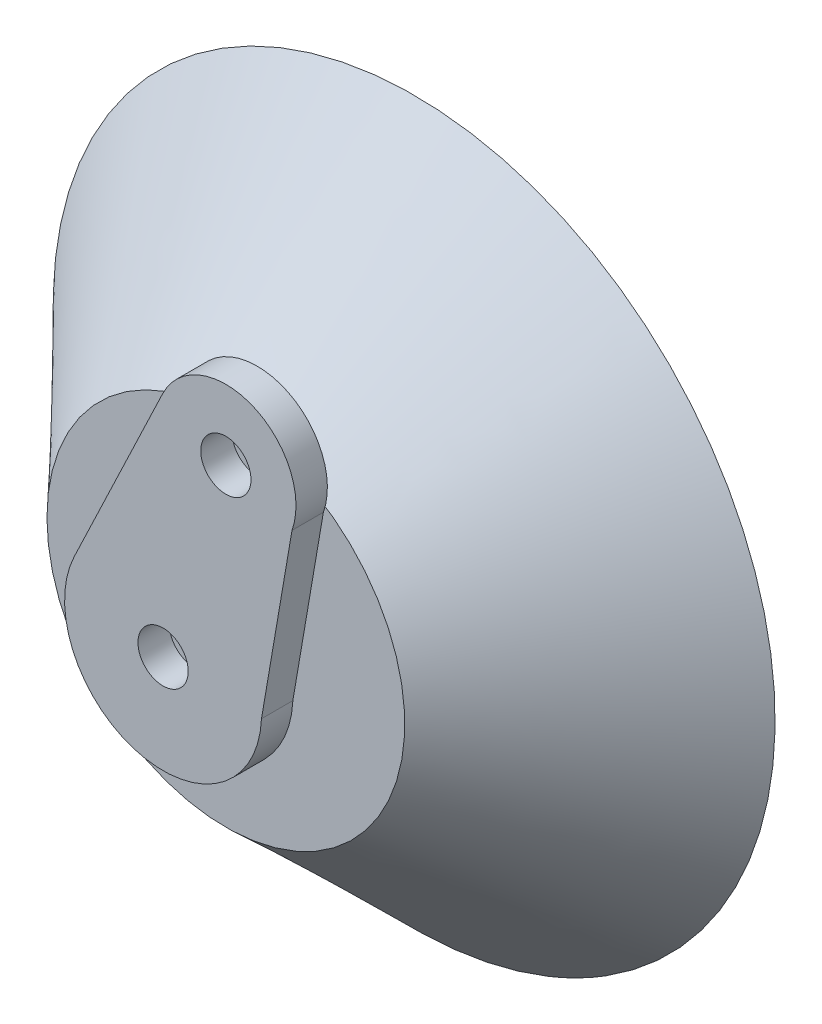
ISO-10303-21;
HEADER;
FILE_DESCRIPTION(('STEP AP214'),'2;1');
FILE_NAME('part.step','',(''),(''),'','','');
FILE_SCHEMA(('AUTOMOTIVE_DESIGN { 1 0 10303 214 1 1 1 1 }'));
ENDSEC;
DATA;
#1=APPLICATION_CONTEXT('core data for automotive mechanical design processes');
#2=APPLICATION_PROTOCOL_DEFINITION('international standard','automotive_design',2000,#1);
#3=PRODUCT_CONTEXT('',#1,'mechanical');
#4=PRODUCT('Part','Part','',(#3));
#5=PRODUCT_RELATED_PRODUCT_CATEGORY('part','',(#4));
#6=PRODUCT_DEFINITION_FORMATION('','',#4);
#7=PRODUCT_DEFINITION_CONTEXT('part definition',#1,'design');
#8=PRODUCT_DEFINITION('design','',#6,#7);
#9=PRODUCT_DEFINITION_SHAPE('','',#8);
#10=(LENGTH_UNIT() NAMED_UNIT(*) SI_UNIT(.MILLI.,.METRE.));
#11=(NAMED_UNIT(*) PLANE_ANGLE_UNIT() SI_UNIT($,.RADIAN.));
#12=(NAMED_UNIT(*) SI_UNIT($,.STERADIAN.) SOLID_ANGLE_UNIT());
#13=UNCERTAINTY_MEASURE_WITH_UNIT(LENGTH_MEASURE(1.E-05),#10,'distance_accuracy_value','');
#14=(GEOMETRIC_REPRESENTATION_CONTEXT(3) GLOBAL_UNCERTAINTY_ASSIGNED_CONTEXT((#13)) GLOBAL_UNIT_ASSIGNED_CONTEXT((#10,
#11,#12)) REPRESENTATION_CONTEXT('',''));
#15=CARTESIAN_POINT('',(0.,0.,0.));
#16=DIRECTION('',(0.,0.,1.));
#17=DIRECTION('',(1.,0.,0.));
#18=AXIS2_PLACEMENT_3D('',#15,#16,#17);
#19=CARTESIAN_POINT('',(0.,0.,40.));
#20=DIRECTION('',(0.,0.,1.));
#21=DIRECTION('',(1.,0.,0.));
#22=AXIS2_PLACEMENT_3D('',#19,#20,#21);
#23=PLANE('',#22);
#24=CARTESIAN_POINT('',(10.,31.4483703870328,40.));
#25=DIRECTION('',(0.,0.,1.));
#26=DIRECTION('',(1.,0.,0.));
#27=AXIS2_PLACEMENT_3D('',#24,#25,#26);
#28=CIRCLE('',#27,4.);
#29=CARTESIAN_POINT('',(14.,31.4483703870328,40.));
#30=VERTEX_POINT('',#29);
#31=EDGE_CURVE('E112',#30,#30,#28,.T.);
#32=ORIENTED_EDGE('',*,*,#31,.F.);
#33=EDGE_LOOP('',(#32));
#34=FACE_BOUND('',#33,.T.);
#35=CARTESIAN_POINT('',(0.,0.,40.));
#36=DIRECTION('',(0.,0.,1.));
#37=DIRECTION('',(1.,0.,0.));
#38=AXIS2_PLACEMENT_3D('',#35,#36,#37);
#39=CIRCLE('',#38,15.6890980476129);
#40=CARTESIAN_POINT('',(-14.1599177681682,6.75607329343942,40.));
#41=VERTEX_POINT('',#40);
#42=CARTESIAN_POINT('',(15.674084091578,-0.686210928034234,40.));
#43=VERTEX_POINT('',#42);
#44=EDGE_CURVE('E97',#41,#43,#39,.T.);
#45=ORIENTED_EDGE('',*,*,#44,.T.);
#46=DIRECTION('',(0.168641585651094,0.985677439931078,0.));
#47=VECTOR('',#46,1.);
#48=CARTESIAN_POINT('',(20.5365896802842,27.734193456935,40.));
#49=LINE('',#48,#47);
#50=CARTESIAN_POINT('',(20.5365896802842,27.734193456935,40.));
#51=VERTEX_POINT('',#50);
#52=EDGE_CURVE('E92',#43,#51,#49,.T.);
#53=ORIENTED_EDGE('',*,*,#52,.T.);
#54=CARTESIAN_POINT('',(10.,31.4483703870328,40.));
#55=DIRECTION('',(0.,0.,1.));
#56=DIRECTION('',(1.,0.,0.));
#57=AXIS2_PLACEMENT_3D('',#54,#55,#56);
#58=CIRCLE('',#57,11.1720558698362);
#59=CARTESIAN_POINT('',(-0.0831412958332035,36.2593052199946,40.));
#60=VERTEX_POINT('',#59);
#61=EDGE_CURVE('E95',#51,#60,#58,.T.);
#62=ORIENTED_EDGE('',*,*,#61,.T.);
#63=DIRECTION('',(-0.430622160237399,-0.902532301423321,0.));
#64=VECTOR('',#63,1.);
#65=CARTESIAN_POINT('',(-0.0831412958332053,36.2593052199946,40.));
#66=LINE('',#65,#64);
#67=EDGE_CURVE('E62',#60,#41,#66,.T.);
#68=ORIENTED_EDGE('',*,*,#67,.T.);
#69=EDGE_LOOP('',(#45,#53,#62,#68));
#70=FACE_BOUND('',#69,.T.);
#71=CARTESIAN_POINT('',(0.,0.,40.));
#72=DIRECTION('',(0.,0.,1.));
#73=DIRECTION('',(1.,0.,0.));
#74=AXIS2_PLACEMENT_3D('',#71,#72,#73);
#75=CIRCLE('',#74,4.);
#76=CARTESIAN_POINT('',(4.,0.,40.));
#77=VERTEX_POINT('',#76);
#78=EDGE_CURVE('E127',#77,#77,#75,.T.);
#79=ORIENTED_EDGE('',*,*,#78,.F.);
#80=EDGE_LOOP('',(#79));
#81=FACE_BOUND('',#80,.T.);
#82=ADVANCED_FACE('F45',(#34,#70,#81),#23,.T.);
#83=CARTESIAN_POINT('',(0.,0.,35.));
#84=DIRECTION('',(0.,0.,1.));
#85=DIRECTION('',(1.,0.,0.));
#86=AXIS2_PLACEMENT_3D('',#83,#84,#85);
#87=PLANE('',#86);
#88=CARTESIAN_POINT('',(10.,31.4483703870328,35.));
#89=DIRECTION('',(0.,0.,1.));
#90=DIRECTION('',(1.,0.,0.));
#91=AXIS2_PLACEMENT_3D('',#88,#89,#90);
#92=CIRCLE('',#91,4.);
#93=CARTESIAN_POINT('',(14.,31.4483703870328,35.));
#94=VERTEX_POINT('',#93);
#95=EDGE_CURVE('E124',#94,#94,#92,.T.);
#96=ORIENTED_EDGE('',*,*,#95,.T.);
#97=EDGE_LOOP('',(#96));
#98=FACE_BOUND('',#97,.T.);
#99=CARTESIAN_POINT('',(0.,0.,35.));
#100=DIRECTION('',(0.,0.,1.));
#101=DIRECTION('',(1.,0.,0.));
#102=AXIS2_PLACEMENT_3D('',#99,#100,#101);
#103=CIRCLE('',#102,15.6890980476129);
#104=CARTESIAN_POINT('',(-14.1599177681682,6.75607329343942,35.));
#105=VERTEX_POINT('',#104);
#106=CARTESIAN_POINT('',(15.674084091578,-0.686210928034234,35.));
#107=VERTEX_POINT('',#106);
#108=EDGE_CURVE('E109',#105,#107,#103,.T.);
#109=ORIENTED_EDGE('',*,*,#108,.F.);
#110=DIRECTION('',(-0.430622160237399,-0.902532301423321,0.));
#111=VECTOR('',#110,1.);
#112=CARTESIAN_POINT('',(-0.0831412958332053,36.2593052199946,35.));
#113=LINE('',#112,#111);
#114=CARTESIAN_POINT('',(-0.0831412958332035,36.2593052199946,35.));
#115=VERTEX_POINT('',#114);
#116=EDGE_CURVE('E85',#115,#105,#113,.T.);
#117=ORIENTED_EDGE('',*,*,#116,.F.);
#118=CARTESIAN_POINT('',(10.,31.4483703870328,35.));
#119=DIRECTION('',(0.,0.,1.));
#120=DIRECTION('',(1.,0.,0.));
#121=AXIS2_PLACEMENT_3D('',#118,#119,#120);
#122=CIRCLE('',#121,11.1720558698362);
#123=CARTESIAN_POINT('',(20.5365896802842,27.734193456935,35.));
#124=VERTEX_POINT('',#123);
#125=EDGE_CURVE('E79',#124,#115,#122,.T.);
#126=ORIENTED_EDGE('',*,*,#125,.F.);
#127=DIRECTION('',(0.168641585651094,0.985677439931078,0.));
#128=VECTOR('',#127,1.);
#129=CARTESIAN_POINT('',(20.5365896802842,27.734193456935,35.));
#130=LINE('',#129,#128);
#131=EDGE_CURVE('E101',#107,#124,#130,.T.);
#132=ORIENTED_EDGE('',*,*,#131,.F.);
#133=EDGE_LOOP('',(#109,#117,#126,#132));
#134=FACE_BOUND('',#133,.T.);
#135=CARTESIAN_POINT('',(0.,0.,35.));
#136=DIRECTION('',(0.,0.,1.));
#137=DIRECTION('',(1.,0.,0.));
#138=AXIS2_PLACEMENT_3D('',#135,#136,#137);
#139=CIRCLE('',#138,4.);
#140=CARTESIAN_POINT('',(4.,0.,35.));
#141=VERTEX_POINT('',#140);
#142=EDGE_CURVE('E130',#141,#141,#139,.T.);
#143=ORIENTED_EDGE('',*,*,#142,.T.);
#144=EDGE_LOOP('',(#143));
#145=FACE_BOUND('',#144,.T.);
#146=ADVANCED_FACE('F120',(#98,#134,#145),#87,.F.);
#147=CARTESIAN_POINT('',(0.,0.,40.));
#148=DIRECTION('',(0.,0.,-1.));
#149=DIRECTION('',(-1.,0.,0.));
#150=AXIS2_PLACEMENT_3D('',#147,#148,#149);
#151=CYLINDRICAL_SURFACE('',#150,15.6890980476129);
#152=ORIENTED_EDGE('',*,*,#108,.T.);
#153=DIRECTION('',(0.,0.,-1.));
#154=VECTOR('',#153,1.);
#155=CARTESIAN_POINT('',(15.674084091578,-0.686210928034234,40.));
#156=LINE('',#155,#154);
#157=EDGE_CURVE('E13',#43,#107,#156,.T.);
#158=ORIENTED_EDGE('',*,*,#157,.F.);
#159=ORIENTED_EDGE('',*,*,#44,.F.);
#160=DIRECTION('',(0.,0.,-1.));
#161=VECTOR('',#160,1.);
#162=CARTESIAN_POINT('',(-14.1599177681682,6.75607329343942,40.));
#163=LINE('',#162,#161);
#164=EDGE_CURVE('E105',#41,#105,#163,.T.);
#165=ORIENTED_EDGE('',*,*,#164,.T.);
#166=EDGE_LOOP('',(#152,#158,#159,#165));
#167=FACE_BOUND('',#166,.T.);
#168=ADVANCED_FACE('F47',(#167),#151,.T.);
#169=CARTESIAN_POINT('',(20.5365896802842,27.734193456935,40.));
#170=DIRECTION('',(-0.985677439931078,0.168641585651094,0.));
#171=DIRECTION('',(-0.168641585651094,-0.985677439931078,0.));
#172=AXIS2_PLACEMENT_3D('',#169,#170,#171);
#173=PLANE('',#172);
#174=ORIENTED_EDGE('',*,*,#131,.T.);
#175=DIRECTION('',(0.,0.,-1.));
#176=VECTOR('',#175,1.);
#177=CARTESIAN_POINT('',(20.5365896802842,27.734193456935,40.));
#178=LINE('',#177,#176);
#179=EDGE_CURVE('E54',#51,#124,#178,.T.);
#180=ORIENTED_EDGE('',*,*,#179,.F.);
#181=ORIENTED_EDGE('',*,*,#52,.F.);
#182=ORIENTED_EDGE('',*,*,#157,.T.);
#183=EDGE_LOOP('',(#174,#180,#181,#182));
#184=FACE_BOUND('',#183,.T.);
#185=ADVANCED_FACE('F100',(#184),#173,.F.);
#186=CARTESIAN_POINT('',(10.,31.4483703870328,40.));
#187=DIRECTION('',(0.,0.,-1.));
#188=DIRECTION('',(-1.,0.,0.));
#189=AXIS2_PLACEMENT_3D('',#186,#187,#188);
#190=CYLINDRICAL_SURFACE('',#189,11.1720558698362);
#191=ORIENTED_EDGE('',*,*,#125,.T.);
#192=DIRECTION('',(0.,0.,-1.));
#193=VECTOR('',#192,1.);
#194=CARTESIAN_POINT('',(-0.0831412958332035,36.2593052199946,40.));
#195=LINE('',#194,#193);
#196=EDGE_CURVE('E102',#60,#115,#195,.T.);
#197=ORIENTED_EDGE('',*,*,#196,.F.);
#198=ORIENTED_EDGE('',*,*,#61,.F.);
#199=ORIENTED_EDGE('',*,*,#179,.T.);
#200=EDGE_LOOP('',(#191,#197,#198,#199));
#201=FACE_BOUND('',#200,.T.);
#202=ADVANCED_FACE('F103',(#201),#190,.T.);
#203=CARTESIAN_POINT('',(-0.0831412958332053,36.2593052199946,40.));
#204=DIRECTION('',(0.902532301423321,-0.430622160237399,0.));
#205=DIRECTION('',(0.430622160237399,0.902532301423321,0.));
#206=AXIS2_PLACEMENT_3D('',#203,#204,#205);
#207=PLANE('',#206);
#208=ORIENTED_EDGE('',*,*,#116,.T.);
#209=ORIENTED_EDGE('',*,*,#164,.F.);
#210=ORIENTED_EDGE('',*,*,#67,.F.);
#211=ORIENTED_EDGE('',*,*,#196,.T.);
#212=EDGE_LOOP('',(#208,#209,#210,#211));
#213=FACE_BOUND('',#212,.T.);
#214=ADVANCED_FACE('F117',(#213),#207,.F.);
#215=CARTESIAN_POINT('',(10.,31.4483703870328,40.));
#216=DIRECTION('',(0.,0.,-1.));
#217=DIRECTION('',(-1.,0.,0.));
#218=AXIS2_PLACEMENT_3D('',#215,#216,#217);
#219=CYLINDRICAL_SURFACE('',#218,4.);
#220=ORIENTED_EDGE('',*,*,#31,.T.);
#221=EDGE_LOOP('',(#220));
#222=FACE_BOUND('',#221,.T.);
#223=ORIENTED_EDGE('',*,*,#95,.F.);
#224=EDGE_LOOP('',(#223));
#225=FACE_BOUND('',#224,.T.);
#226=ADVANCED_FACE('F148',(#222,#225),#219,.F.);
#227=CARTESIAN_POINT('',(0.,0.,40.));
#228=DIRECTION('',(0.,0.,-1.));
#229=DIRECTION('',(-1.,0.,0.));
#230=AXIS2_PLACEMENT_3D('',#227,#228,#229);
#231=CYLINDRICAL_SURFACE('',#230,4.);
#232=ORIENTED_EDGE('',*,*,#78,.T.);
#233=EDGE_LOOP('',(#232));
#234=FACE_BOUND('',#233,.T.);
#235=ORIENTED_EDGE('',*,*,#142,.F.);
#236=EDGE_LOOP('',(#235));
#237=FACE_BOUND('',#236,.T.);
#238=ADVANCED_FACE('F136',(#234,#237),#231,.F.);
#239=CLOSED_SHELL('',(#82,#146,#168,#185,#202,#214,#226,#238));
#240=MANIFOLD_SOLID_BREP('B2',#239);
#241=CARTESIAN_POINT('',(0.,0.,30.));
#242=DIRECTION('',(0.,0.,1.));
#243=DIRECTION('',(1.,0.,0.));
#244=AXIS2_PLACEMENT_3D('',#241,#242,#243);
#245=PLANE('',#244);
#246=CARTESIAN_POINT('',(0.,0.,30.));
#247=DIRECTION('',(0.,0.,1.));
#248=DIRECTION('',(1.,0.,0.));
#249=AXIS2_PLACEMENT_3D('',#246,#247,#248);
#250=CIRCLE('',#249,10.);
#251=CARTESIAN_POINT('',(10.,0.,30.));
#252=VERTEX_POINT('',#251);
#253=EDGE_CURVE('E285',#252,#252,#250,.T.);
#254=ORIENTED_EDGE('',*,*,#253,.F.);
#255=EDGE_LOOP('',(#254));
#256=FACE_BOUND('',#255,.T.);
#257=CARTESIAN_POINT('',(0.,0.,30.));
#258=DIRECTION('',(0.,0.,1.));
#259=DIRECTION('',(1.,0.,0.));
#260=AXIS2_PLACEMENT_3D('',#257,#258,#259);
#261=CIRCLE('',#260,28.5);
#262=CARTESIAN_POINT('',(0.80571115295279,28.4886087680323,30.));
#263=VERTEX_POINT('',#262);
#264=EDGE_CURVE('E218',#263,#263,#261,.T.);
#265=ORIENTED_EDGE('',*,*,#264,.T.);
#266=EDGE_LOOP('',(#265));
#267=FACE_BOUND('',#266,.T.);
#268=ADVANCED_FACE('F210',(#256,#267),#245,.T.);
#269=CARTESIAN_POINT('',(0.,0.,0.));
#270=DIRECTION('',(0.,0.,1.));
#271=DIRECTION('',(1.,0.,0.));
#272=AXIS2_PLACEMENT_3D('',#269,#270,#271);
#273=PLANE('',#272);
#274=CARTESIAN_POINT('',(0.,0.,0.));
#275=DIRECTION('',(0.,0.,1.));
#276=DIRECTION('',(1.,0.,0.));
#277=AXIS2_PLACEMENT_3D('',#274,#275,#276);
#278=CIRCLE('',#277,10.);
#279=CARTESIAN_POINT('',(10.,0.,0.));
#280=VERTEX_POINT('',#279);
#281=EDGE_CURVE('E214',#280,#280,#278,.T.);
#282=ORIENTED_EDGE('',*,*,#281,.T.);
#283=EDGE_LOOP('',(#282));
#284=FACE_BOUND('',#283,.T.);
#285=CARTESIAN_POINT('',(0.,0.,0.));
#286=DIRECTION('',(0.,0.,1.));
#287=DIRECTION('',(1.,0.,0.));
#288=AXIS2_PLACEMENT_3D('',#285,#286,#287);
#289=CIRCLE('',#288,57.5);
#290=CARTESIAN_POINT('',(-11.5187221230247,56.3344392059825,0.));
#291=VERTEX_POINT('',#290);
#292=EDGE_CURVE('E44',#291,#291,#289,.T.);
#293=ORIENTED_EDGE('',*,*,#292,.F.);
#294=EDGE_LOOP('',(#293));
#295=FACE_BOUND('',#294,.T.);
#296=ADVANCED_FACE('F263',(#284,#295),#273,.F.);
#297=CARTESIAN_POINT('',(-11.5187221230247,56.3344392059825,0.));
#298=CARTESIAN_POINT('',(0.80571115295279,28.4886087680323,30.));
#299=CARTESIAN_POINT('',(-124.18760053499,33.2969949599331,0.));
#300=CARTESIAN_POINT('',(-56.1715063831118,30.1000310739379,30.));
#301=CARTESIAN_POINT('',(-101.15015628894,-79.371883452032,0.));
#302=CARTESIAN_POINT('',(-57.7829286890174,-26.8771864621267,30.));
#303=CARTESIAN_POINT('',(11.5187221230247,-56.3344392059825,0.));
#304=CARTESIAN_POINT('',(-0.805711152952793,-28.4886087680323,30.));
#305=CARTESIAN_POINT('',(124.18760053499,-33.296994959933,0.));
#306=CARTESIAN_POINT('',(56.1715063831118,-30.1000310739379,30.));
#307=CARTESIAN_POINT('',(101.15015628894,79.371883452032,0.));
#308=CARTESIAN_POINT('',(57.7829286890174,26.8771864621267,30.));
#309=CARTESIAN_POINT('',(-11.5187221230247,56.3344392059825,0.));
#310=CARTESIAN_POINT('',(0.80571115295279,28.4886087680323,30.));
#311=(BOUNDED_SURFACE() B_SPLINE_SURFACE(3,1,((#297,#298),(#299,#300),(#301,#302),(#303,#304),
(#305,#306),(#307,#308),(#309,#310)),.UNSPECIFIED.,.T.,.F.,.F.) B_SPLINE_SURFACE_WITH_KNOTS((4,
3,4),(2,2),(0.,0.5,1.),(0.,1.),
.UNSPECIFIED.) GEOMETRIC_REPRESENTATION_ITEM() RATIONAL_B_SPLINE_SURFACE(((1.,1.),
(0.333333333333333,0.333333333333333),(0.333333333333333,0.333333333333333),(1.,1.),
(0.333333333333333,0.333333333333333),(0.333333333333333,0.333333333333333),(1.,1.))) REPRESENTATION_ITEM('') SURFACE());
#312=CARTESIAN_POINT('',(-11.5187221230247,56.3344392059825,0.));
#313=CARTESIAN_POINT('',(-11.3903426097333,56.0443784722539,0.312500000000001));
#314=CARTESIAN_POINT('',(-11.2619630964418,55.7543177385252,0.625000000000001));
#315=CARTESIAN_POINT('',(-11.005204069859,55.1741962710679,1.25));
#316=CARTESIAN_POINT('',(-10.8768245565676,54.8841355373393,1.5625));
#317=CARTESIAN_POINT('',(-10.6200655299847,54.304014069882,2.1875));
#318=CARTESIAN_POINT('',(-10.4916860166933,54.0139533361533,2.5));
#319=CARTESIAN_POINT('',(-10.2349269901104,53.4338318686961,3.125));
#320=CARTESIAN_POINT('',(-10.106547476819,53.1437711349674,3.4375));
#321=CARTESIAN_POINT('',(-9.8497884502361,52.5636496675101,4.0625));
#322=CARTESIAN_POINT('',(-9.72140893694466,52.2735889337815,4.375));
#323=CARTESIAN_POINT('',(-9.46464991036179,51.6934674663242,5.));
#324=CARTESIAN_POINT('',(-9.33627039707036,51.4034067325955,5.3125));
#325=CARTESIAN_POINT('',(-9.0795113704875,50.8232852651382,5.9375));
#326=CARTESIAN_POINT('',(-8.95113185719607,50.5332245314096,6.25));
#327=CARTESIAN_POINT('',(-8.6943728306132,49.9531030639523,6.875));
#328=CARTESIAN_POINT('',(-8.56599331732177,49.6630423302236,7.1875));
#329=CARTESIAN_POINT('',(-8.30923429073891,49.0829208627663,7.8125));
#330=CARTESIAN_POINT('',(-8.18085477744747,48.7928601290377,8.125));
#331=CARTESIAN_POINT('',(-7.92409575086461,48.2127386615804,8.75));
#332=CARTESIAN_POINT('',(-7.79571623757318,47.9226779278517,9.0625));
#333=CARTESIAN_POINT('',(-7.53895721099031,47.3425564603944,9.6875));
#334=CARTESIAN_POINT('',(-7.41057769769888,47.0524957266658,10.));
#335=CARTESIAN_POINT('',(-7.15381867111602,46.4723742592085,10.625));
#336=CARTESIAN_POINT('',(-7.02543915782458,46.1823135254798,10.9375));
#337=CARTESIAN_POINT('',(-6.76868013124172,45.6021920580226,11.5625));
#338=CARTESIAN_POINT('',(-6.64030061795029,45.3121313242939,11.875));
#339=CARTESIAN_POINT('',(-6.38354159136742,44.7320098568366,12.5));
#340=CARTESIAN_POINT('',(-6.25516207807599,44.441949123108,12.8125));
#341=CARTESIAN_POINT('',(-5.99840305149312,43.8618276556507,13.4375));
#342=CARTESIAN_POINT('',(-5.87002353820169,43.571766921922,13.75));
#343=CARTESIAN_POINT('',(-5.61326451161883,42.9916454544647,14.375));
#344=CARTESIAN_POINT('',(-5.48488499832739,42.7015847207361,14.6875));
#345=CARTESIAN_POINT('',(-5.22812597174453,42.1214632532788,15.3125));
#346=CARTESIAN_POINT('',(-5.0997464584531,41.8314025195501,15.625));
#347=CARTESIAN_POINT('',(-4.84298743187023,41.2512810520928,16.25));
#348=CARTESIAN_POINT('',(-4.7146079185788,40.9612203183642,16.5625));
#349=CARTESIAN_POINT('',(-4.45784889199594,40.3810988509069,17.1875));
#350=CARTESIAN_POINT('',(-4.3294693787045,40.0910381171782,17.5));
#351=CARTESIAN_POINT('',(-4.07271035212164,39.5109166497209,18.125));
#352=CARTESIAN_POINT('',(-3.94433083883021,39.2208559159923,18.4375));
#353=CARTESIAN_POINT('',(-3.68757181224734,38.640734448535,19.0625));
#354=CARTESIAN_POINT('',(-3.55919229895591,38.3506737148063,19.375));
#355=CARTESIAN_POINT('',(-3.30243327237304,37.7705522473491,20.));
#356=CARTESIAN_POINT('',(-3.17405375908161,37.4804915136204,20.3125));
#357=CARTESIAN_POINT('',(-2.91729473249875,36.9003700461631,20.9375));
#358=CARTESIAN_POINT('',(-2.78891521920731,36.6103093124345,21.25));
#359=CARTESIAN_POINT('',(-2.53215619262445,36.0301878449772,21.875));
#360=CARTESIAN_POINT('',(-2.40377667933302,35.7401271112485,22.1875));
#361=CARTESIAN_POINT('',(-2.14701765275015,35.1600056437912,22.8125));
#362=CARTESIAN_POINT('',(-2.01863813945872,34.8699449100626,23.125));
#363=CARTESIAN_POINT('',(-1.76187911287586,34.2898234426053,23.75));
#364=CARTESIAN_POINT('',(-1.63349959958442,33.9997627088766,24.0625));
#365=CARTESIAN_POINT('',(-1.37674057300156,33.4196412414193,24.6875));
#366=CARTESIAN_POINT('',(-1.24836105971013,33.1295805076907,25.));
#367=CARTESIAN_POINT('',(-0.991602033127263,32.5494590402334,25.625));
#368=CARTESIAN_POINT('',(-0.86322251983583,32.2593983065047,25.9375));
#369=CARTESIAN_POINT('',(-0.606463493252966,31.6792768390474,26.5625));
#370=CARTESIAN_POINT('',(-0.478083979961533,31.3892161053188,26.875));
#371=CARTESIAN_POINT('',(-0.221324953378669,30.8090946378615,27.5));
#372=CARTESIAN_POINT('',(-0.0929454400872366,30.5190339041329,27.8125));
#373=CARTESIAN_POINT('',(0.163813586495628,29.9389124366756,28.4375));
#374=CARTESIAN_POINT('',(0.292193099787061,29.6488517029469,28.75));
#375=CARTESIAN_POINT('',(0.548952126369926,29.0687302354896,29.375));
#376=CARTESIAN_POINT('',(0.677331639661358,28.778669501761,29.6875));
#377=CARTESIAN_POINT('',(0.80571115295279,28.4886087680323,30.));
#378=B_SPLINE_CURVE_WITH_KNOTS('',3,(#312,#313,#314,#315,#316,#317,#318,#319,#320,#321,#322,
#323,#324,#325,#326,#327,#328,#329,#330,#331,#332,#333,#334,#335,#336,#337,#338,#339,#340,#341,
#342,#343,#344,#345,#346,#347,#348,#349,#350,#351,#352,#353,#354,#355,#356,#357,#358,#359,#360,
#361,#362,#363,#364,#365,#366,#367,#368,#369,#370,#371,#372,#373,#374,#375,#376,#377),
.UNSPECIFIED.,.F.,.F.,(4,2,2,2,2,2,2,2,2,2,2,2,2,2,2,2,2,2,2,2,2,2,2,2,2,2,2,2,2,2,2,2,4),(0.,
1.33583494794729,2.67166989589457,4.00750484384185,5.34333979178913,6.67917473973641,
8.0150096876837,9.35084463563098,10.6866795835783,12.0225145315255,13.3583494794728,
14.6941844274201,16.0300193753674,17.3658543233147,18.701689271262,20.0375242192092,
21.3733591671565,22.7091941151038,24.0450290630511,25.3808640109984,26.7166989589457,
28.0525339068929,29.3883688548402,30.7242038027875,32.0600387507348,33.3958736986821,
34.7317086466294,36.0675435945766,37.4033785425239,38.7392134904712,40.0750484384185,
41.4108833863658,42.7467183343131),.UNSPECIFIED.);
#379=EDGE_CURVE('BSEAM246',#291,#263,#378,.T.);
#380=ORIENTED_EDGE('',*,*,#292,.T.);
#381=ORIENTED_EDGE('',*,*,#264,.F.);
#382=ORIENTED_EDGE('',*,*,#379,.T.);
#383=ORIENTED_EDGE('',*,*,#379,.F.);
#384=EDGE_LOOP('',(#380,#382,#381,#383));
#385=FACE_BOUND('',#384,.T.);
#386=ADVANCED_FACE('F246',(#385),#311,.T.);
#387=CARTESIAN_POINT('',(0.,0.,-9.99999999994061E-05));
#388=DIRECTION('',(0.,0.,1.));
#389=DIRECTION('',(1.,0.,0.));
#390=AXIS2_PLACEMENT_3D('',#387,#388,#389);
#391=CYLINDRICAL_SURFACE('',#390,10.);
#392=ORIENTED_EDGE('',*,*,#253,.T.);
#393=EDGE_LOOP('',(#392));
#394=FACE_BOUND('',#393,.T.);
#395=ORIENTED_EDGE('',*,*,#281,.F.);
#396=EDGE_LOOP('',(#395));
#397=FACE_BOUND('',#396,.T.);
#398=ADVANCED_FACE('F262',(#394,#397),#391,.F.);
#399=CLOSED_SHELL('',(#268,#296,#386,#398));
#400=MANIFOLD_SOLID_BREP('B7',#399);
#401=ADVANCED_BREP_SHAPE_REPRESENTATION('',(#18,#240,#400),#14);
#402=SHAPE_DEFINITION_REPRESENTATION(#9,#401);
ENDSEC;
END-ISO-10303-21;
